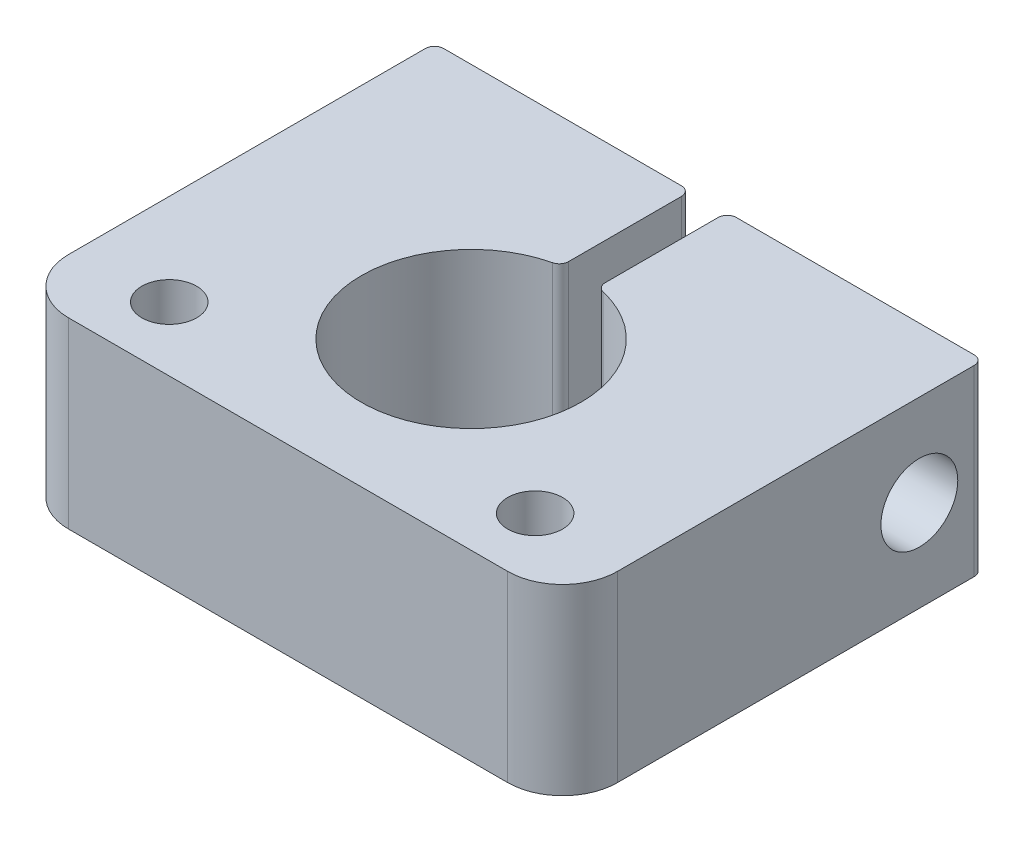
ISO-10303-21;
HEADER;
FILE_DESCRIPTION(('STEP AP214'),'2;1');
FILE_NAME('part.step','',(''),(''),'','','');
FILE_SCHEMA(('AUTOMOTIVE_DESIGN { 1 0 10303 214 1 1 1 1 }'));
ENDSEC;
DATA;
#1=APPLICATION_CONTEXT('core data for automotive mechanical design processes');
#2=APPLICATION_PROTOCOL_DEFINITION('international standard','automotive_design',2000,#1);
#3=PRODUCT_CONTEXT('',#1,'mechanical');
#4=PRODUCT('Part','Part','',(#3));
#5=PRODUCT_RELATED_PRODUCT_CATEGORY('part','',(#4));
#6=PRODUCT_DEFINITION_FORMATION('','',#4);
#7=PRODUCT_DEFINITION_CONTEXT('part definition',#1,'design');
#8=PRODUCT_DEFINITION('design','',#6,#7);
#9=PRODUCT_DEFINITION_SHAPE('','',#8);
#10=(LENGTH_UNIT() NAMED_UNIT(*) SI_UNIT(.MILLI.,.METRE.));
#11=(NAMED_UNIT(*) PLANE_ANGLE_UNIT() SI_UNIT($,.RADIAN.));
#12=(NAMED_UNIT(*) SI_UNIT($,.STERADIAN.) SOLID_ANGLE_UNIT());
#13=UNCERTAINTY_MEASURE_WITH_UNIT(LENGTH_MEASURE(1.E-05),#10,'distance_accuracy_value','');
#14=(GEOMETRIC_REPRESENTATION_CONTEXT(3) GLOBAL_UNCERTAINTY_ASSIGNED_CONTEXT((#13)) GLOBAL_UNIT_ASSIGNED_CONTEXT((#10,
#11,#12)) REPRESENTATION_CONTEXT('',''));
#15=CARTESIAN_POINT('',(0.,0.,0.));
#16=DIRECTION('',(0.,0.,1.));
#17=DIRECTION('',(1.,0.,0.));
#18=AXIS2_PLACEMENT_3D('',#15,#16,#17);
#19=CARTESIAN_POINT('',(0.,10.,0.));
#20=DIRECTION('',(0.,0.,1.));
#21=DIRECTION('',(1.,0.,0.));
#22=AXIS2_PLACEMENT_3D('',#19,#20,#21);
#23=PLANE('',#22);
#24=DIRECTION('',(-1.,0.,0.));
#25=VECTOR('',#24,1.);
#26=CARTESIAN_POINT('',(0.,0.,0.));
#27=LINE('',#26,#25);
#28=CARTESIAN_POINT('',(29.5,0.,0.));
#29=VERTEX_POINT('',#28);
#30=CARTESIAN_POINT('',(16.5,0.,0.));
#31=VERTEX_POINT('',#30);
#32=EDGE_CURVE('E182',#29,#31,#27,.T.);
#33=ORIENTED_EDGE('',*,*,#32,.T.);
#34=DIRECTION('',(0.,1.,0.));
#35=VECTOR('',#34,1.);
#36=CARTESIAN_POINT('',(16.5,10.,0.));
#37=LINE('',#36,#35);
#38=CARTESIAN_POINT('',(16.5,10.,0.));
#39=VERTEX_POINT('',#38);
#40=EDGE_CURVE('E40',#31,#39,#37,.T.);
#41=ORIENTED_EDGE('',*,*,#40,.T.);
#42=DIRECTION('',(-1.,0.,0.));
#43=VECTOR('',#42,1.);
#44=CARTESIAN_POINT('',(0.,10.,0.));
#45=LINE('',#44,#43);
#46=CARTESIAN_POINT('',(29.5,10.,0.));
#47=VERTEX_POINT('',#46);
#48=EDGE_CURVE('E186',#47,#39,#45,.T.);
#49=ORIENTED_EDGE('',*,*,#48,.F.);
#50=DIRECTION('',(0.,-1.,0.));
#51=VECTOR('',#50,1.);
#52=CARTESIAN_POINT('',(29.5,10.,0.));
#53=LINE('',#52,#51);
#54=EDGE_CURVE('E241',#47,#29,#53,.T.);
#55=ORIENTED_EDGE('',*,*,#54,.T.);
#56=EDGE_LOOP('',(#33,#41,#49,#55));
#57=FACE_BOUND('',#56,.T.);
#58=ADVANCED_FACE('F32',(#57),#23,.F.);
#59=CARTESIAN_POINT('',(0.,10.,0.));
#60=DIRECTION('',(0.,1.,0.));
#61=DIRECTION('',(0.,0.,1.));
#62=AXIS2_PLACEMENT_3D('',#59,#60,#61);
#63=PLANE('',#62);
#64=CARTESIAN_POINT('',(13.5,10.,0.));
#65=VERTEX_POINT('',#64);
#66=CARTESIAN_POINT('',(0.5,10.,0.));
#67=VERTEX_POINT('',#66);
#68=EDGE_CURVE('E259',#65,#67,#45,.T.);
#69=ORIENTED_EDGE('',*,*,#68,.T.);
#70=CARTESIAN_POINT('',(0.5,10.,0.5));
#71=DIRECTION('',(0.,1.,0.));
#72=DIRECTION('',(0.,0.,1.));
#73=AXIS2_PLACEMENT_3D('',#70,#71,#72);
#74=CIRCLE('',#73,0.5);
#75=CARTESIAN_POINT('',(0.,10.,0.5));
#76=VERTEX_POINT('',#75);
#77=EDGE_CURVE('E226',#67,#76,#74,.T.);
#78=ORIENTED_EDGE('',*,*,#77,.T.);
#79=DIRECTION('',(0.,0.,1.));
#80=VECTOR('',#79,1.);
#81=CARTESIAN_POINT('',(0.,10.,0.));
#82=LINE('',#81,#80);
#83=CARTESIAN_POINT('',(0.,10.,20.));
#84=VERTEX_POINT('',#83);
#85=EDGE_CURVE('E185',#76,#84,#82,.T.);
#86=ORIENTED_EDGE('',*,*,#85,.T.);
#87=CARTESIAN_POINT('',(3.,10.,20.));
#88=DIRECTION('',(0.,1.,0.));
#89=DIRECTION('',(0.,0.,1.));
#90=AXIS2_PLACEMENT_3D('',#87,#88,#89);
#91=CIRCLE('',#90,3.);
#92=CARTESIAN_POINT('',(3.,10.,23.));
#93=VERTEX_POINT('',#92);
#94=EDGE_CURVE('E192',#84,#93,#91,.T.);
#95=ORIENTED_EDGE('',*,*,#94,.T.);
#96=DIRECTION('',(1.,0.,0.));
#97=VECTOR('',#96,1.);
#98=CARTESIAN_POINT('',(0.,10.,23.));
#99=LINE('',#98,#97);
#100=CARTESIAN_POINT('',(27.,10.,23.));
#101=VERTEX_POINT('',#100);
#102=EDGE_CURVE('E166',#93,#101,#99,.T.);
#103=ORIENTED_EDGE('',*,*,#102,.T.);
#104=CARTESIAN_POINT('',(27.,10.,20.));
#105=DIRECTION('',(0.,1.,0.));
#106=DIRECTION('',(0.,0.,1.));
#107=AXIS2_PLACEMENT_3D('',#104,#105,#106);
#108=CIRCLE('',#107,3.);
#109=CARTESIAN_POINT('',(30.,10.,20.));
#110=VERTEX_POINT('',#109);
#111=EDGE_CURVE('E190',#101,#110,#108,.T.);
#112=ORIENTED_EDGE('',*,*,#111,.T.);
#113=DIRECTION('',(0.,0.,-1.));
#114=VECTOR('',#113,1.);
#115=CARTESIAN_POINT('',(30.,10.,0.));
#116=LINE('',#115,#114);
#117=CARTESIAN_POINT('',(30.,10.,0.5));
#118=VERTEX_POINT('',#117);
#119=EDGE_CURVE('E260',#110,#118,#116,.T.);
#120=ORIENTED_EDGE('',*,*,#119,.T.);
#121=CARTESIAN_POINT('',(29.5,10.,0.5));
#122=DIRECTION('',(0.,1.,0.));
#123=DIRECTION('',(0.,0.,1.));
#124=AXIS2_PLACEMENT_3D('',#121,#122,#123);
#125=CIRCLE('',#124,0.5);
#126=EDGE_CURVE('E217',#118,#47,#125,.T.);
#127=ORIENTED_EDGE('',*,*,#126,.T.);
#128=ORIENTED_EDGE('',*,*,#48,.T.);
#129=CARTESIAN_POINT('',(16.5,10.,0.5));
#130=DIRECTION('',(0.,1.,0.));
#131=DIRECTION('',(0.,0.,1.));
#132=AXIS2_PLACEMENT_3D('',#129,#130,#131);
#133=CIRCLE('',#132,0.5);
#134=CARTESIAN_POINT('',(16.,10.,0.5));
#135=VERTEX_POINT('',#134);
#136=EDGE_CURVE('E219',#39,#135,#133,.T.);
#137=ORIENTED_EDGE('',*,*,#136,.T.);
#138=DIRECTION('',(0.,0.,-1.));
#139=VECTOR('',#138,1.);
#140=CARTESIAN_POINT('',(16.,10.,-3.));
#141=LINE('',#140,#139);
#142=CARTESIAN_POINT('',(16.,10.,6.67544467966324));
#143=VERTEX_POINT('',#142);
#144=EDGE_CURVE('E286',#143,#135,#141,.T.);
#145=ORIENTED_EDGE('',*,*,#144,.F.);
#146=CARTESIAN_POINT('',(16.5,10.,6.67544467966324));
#147=DIRECTION('',(0.,1.,0.));
#148=DIRECTION('',(0.,0.,1.));
#149=AXIS2_PLACEMENT_3D('',#146,#147,#148);
#150=CIRCLE('',#149,0.5);
#151=CARTESIAN_POINT('',(16.3846153846154,10.,7.16194893507376));
#152=VERTEX_POINT('',#151);
#153=EDGE_CURVE('E224',#143,#152,#150,.T.);
#154=ORIENTED_EDGE('',*,*,#153,.T.);
#155=CARTESIAN_POINT('',(15.,10.,13.));
#156=DIRECTION('',(0.,1.,0.));
#157=DIRECTION('',(0.,0.,1.));
#158=AXIS2_PLACEMENT_3D('',#155,#156,#157);
#159=CIRCLE('',#158,6.);
#160=CARTESIAN_POINT('',(13.6153846153846,10.,7.16194893507376));
#161=VERTEX_POINT('',#160);
#162=EDGE_CURVE('E178',#161,#152,#159,.T.);
#163=ORIENTED_EDGE('',*,*,#162,.F.);
#164=CARTESIAN_POINT('',(13.5,10.,6.67544467966324));
#165=DIRECTION('',(0.,1.,0.));
#166=DIRECTION('',(0.,0.,1.));
#167=AXIS2_PLACEMENT_3D('',#164,#165,#166);
#168=CIRCLE('',#167,0.5);
#169=CARTESIAN_POINT('',(14.,10.,6.67544467966323));
#170=VERTEX_POINT('',#169);
#171=EDGE_CURVE('E47',#161,#170,#168,.T.);
#172=ORIENTED_EDGE('',*,*,#171,.T.);
#173=DIRECTION('',(0.,0.,1.));
#174=VECTOR('',#173,1.);
#175=CARTESIAN_POINT('',(14.,10.,-3.));
#176=LINE('',#175,#174);
#177=CARTESIAN_POINT('',(14.,10.,0.499999999999999));
#178=VERTEX_POINT('',#177);
#179=EDGE_CURVE('E283',#178,#170,#176,.T.);
#180=ORIENTED_EDGE('',*,*,#179,.F.);
#181=CARTESIAN_POINT('',(13.5,10.,0.5));
#182=DIRECTION('',(0.,1.,0.));
#183=DIRECTION('',(0.,0.,1.));
#184=AXIS2_PLACEMENT_3D('',#181,#182,#183);
#185=CIRCLE('',#184,0.5);
#186=EDGE_CURVE('E221',#178,#65,#185,.T.);
#187=ORIENTED_EDGE('',*,*,#186,.T.);
#188=EDGE_LOOP('',(#69,#78,#86,#95,#103,#112,#120,#127,#128,#137,#145,#154,#163,#172,#180,#187));
#189=FACE_BOUND('',#188,.T.);
#190=CARTESIAN_POINT('',(5.,10.,19.5));
#191=DIRECTION('',(0.,1.,0.));
#192=DIRECTION('',(0.,0.,1.));
#193=AXIS2_PLACEMENT_3D('',#190,#191,#192);
#194=CIRCLE('',#193,1.5);
#195=CARTESIAN_POINT('',(5.,10.,21.));
#196=VERTEX_POINT('',#195);
#197=EDGE_CURVE('E268',#196,#196,#194,.T.);
#198=ORIENTED_EDGE('',*,*,#197,.F.);
#199=EDGE_LOOP('',(#198));
#200=FACE_BOUND('',#199,.T.);
#201=CARTESIAN_POINT('',(25.,10.,19.5));
#202=DIRECTION('',(0.,1.,0.));
#203=DIRECTION('',(0.,0.,1.));
#204=AXIS2_PLACEMENT_3D('',#201,#202,#203);
#205=CIRCLE('',#204,1.5);
#206=CARTESIAN_POINT('',(25.,10.,21.));
#207=VERTEX_POINT('',#206);
#208=EDGE_CURVE('E274',#207,#207,#205,.T.);
#209=ORIENTED_EDGE('',*,*,#208,.F.);
#210=EDGE_LOOP('',(#209));
#211=FACE_BOUND('',#210,.T.);
#212=ADVANCED_FACE('F253',(#189,#200,#211),#63,.T.);
#213=CARTESIAN_POINT('',(0.,0.,0.));
#214=DIRECTION('',(0.,1.,0.));
#215=DIRECTION('',(0.,0.,1.));
#216=AXIS2_PLACEMENT_3D('',#213,#214,#215);
#217=PLANE('',#216);
#218=DIRECTION('',(0.,0.,1.));
#219=VECTOR('',#218,1.);
#220=CARTESIAN_POINT('',(0.,0.,0.));
#221=LINE('',#220,#219);
#222=CARTESIAN_POINT('',(0.,0.,0.5));
#223=VERTEX_POINT('',#222);
#224=CARTESIAN_POINT('',(0.,0.,20.));
#225=VERTEX_POINT('',#224);
#226=EDGE_CURVE('E173',#223,#225,#221,.T.);
#227=ORIENTED_EDGE('',*,*,#226,.F.);
#228=CARTESIAN_POINT('',(0.5,0.,0.5));
#229=DIRECTION('',(0.,1.,0.));
#230=DIRECTION('',(0.,0.,1.));
#231=AXIS2_PLACEMENT_3D('',#228,#229,#230);
#232=CIRCLE('',#231,0.5);
#233=CARTESIAN_POINT('',(0.5,0.,0.));
#234=VERTEX_POINT('',#233);
#235=EDGE_CURVE('E210',#223,#234,#232,.F.);
#236=ORIENTED_EDGE('',*,*,#235,.T.);
#237=CARTESIAN_POINT('',(13.5,0.,0.));
#238=VERTEX_POINT('',#237);
#239=EDGE_CURVE('E176',#238,#234,#27,.T.);
#240=ORIENTED_EDGE('',*,*,#239,.F.);
#241=CARTESIAN_POINT('',(13.5,0.,0.5));
#242=DIRECTION('',(0.,1.,0.));
#243=DIRECTION('',(0.,0.,1.));
#244=AXIS2_PLACEMENT_3D('',#241,#242,#243);
#245=CIRCLE('',#244,0.5);
#246=CARTESIAN_POINT('',(14.,0.,0.499999999999999));
#247=VERTEX_POINT('',#246);
#248=EDGE_CURVE('E204',#238,#247,#245,.F.);
#249=ORIENTED_EDGE('',*,*,#248,.T.);
#250=DIRECTION('',(0.,0.,1.));
#251=VECTOR('',#250,1.);
#252=CARTESIAN_POINT('',(14.,0.,-3.));
#253=LINE('',#252,#251);
#254=CARTESIAN_POINT('',(14.,0.,6.67544467966323));
#255=VERTEX_POINT('',#254);
#256=EDGE_CURVE('E280',#247,#255,#253,.T.);
#257=ORIENTED_EDGE('',*,*,#256,.T.);
#258=CARTESIAN_POINT('',(13.5,0.,6.67544467966324));
#259=DIRECTION('',(0.,1.,0.));
#260=DIRECTION('',(0.,0.,1.));
#261=AXIS2_PLACEMENT_3D('',#258,#259,#260);
#262=CIRCLE('',#261,0.5);
#263=CARTESIAN_POINT('',(13.6153846153846,0.,7.16194893507376));
#264=VERTEX_POINT('',#263);
#265=EDGE_CURVE('E206',#255,#264,#262,.F.);
#266=ORIENTED_EDGE('',*,*,#265,.T.);
#267=CARTESIAN_POINT('',(15.,0.,13.));
#268=DIRECTION('',(0.,1.,0.));
#269=DIRECTION('',(0.,0.,1.));
#270=AXIS2_PLACEMENT_3D('',#267,#268,#269);
#271=CIRCLE('',#270,6.);
#272=CARTESIAN_POINT('',(16.3846153846154,0.,7.16194893507376));
#273=VERTEX_POINT('',#272);
#274=EDGE_CURVE('E265',#264,#273,#271,.T.);
#275=ORIENTED_EDGE('',*,*,#274,.T.);
#276=CARTESIAN_POINT('',(16.5,0.,6.67544467966324));
#277=DIRECTION('',(0.,1.,0.));
#278=DIRECTION('',(0.,0.,1.));
#279=AXIS2_PLACEMENT_3D('',#276,#277,#278);
#280=CIRCLE('',#279,0.5);
#281=CARTESIAN_POINT('',(16.,0.,6.67544467966324));
#282=VERTEX_POINT('',#281);
#283=EDGE_CURVE('E208',#273,#282,#280,.F.);
#284=ORIENTED_EDGE('',*,*,#283,.T.);
#285=DIRECTION('',(0.,0.,-1.));
#286=VECTOR('',#285,1.);
#287=CARTESIAN_POINT('',(16.,0.,-3.));
#288=LINE('',#287,#286);
#289=CARTESIAN_POINT('',(16.,0.,0.5));
#290=VERTEX_POINT('',#289);
#291=EDGE_CURVE('E285',#282,#290,#288,.T.);
#292=ORIENTED_EDGE('',*,*,#291,.T.);
#293=CARTESIAN_POINT('',(16.5,0.,0.5));
#294=DIRECTION('',(0.,1.,0.));
#295=DIRECTION('',(0.,0.,1.));
#296=AXIS2_PLACEMENT_3D('',#293,#294,#295);
#297=CIRCLE('',#296,0.5);
#298=EDGE_CURVE('E202',#290,#31,#297,.F.);
#299=ORIENTED_EDGE('',*,*,#298,.T.);
#300=ORIENTED_EDGE('',*,*,#32,.F.);
#301=CARTESIAN_POINT('',(29.5,0.,0.5));
#302=DIRECTION('',(0.,1.,0.));
#303=DIRECTION('',(0.,0.,1.));
#304=AXIS2_PLACEMENT_3D('',#301,#302,#303);
#305=CIRCLE('',#304,0.5);
#306=CARTESIAN_POINT('',(30.,0.,0.5));
#307=VERTEX_POINT('',#306);
#308=EDGE_CURVE('E200',#29,#307,#305,.F.);
#309=ORIENTED_EDGE('',*,*,#308,.T.);
#310=DIRECTION('',(0.,0.,-1.));
#311=VECTOR('',#310,1.);
#312=CARTESIAN_POINT('',(30.,0.,0.));
#313=LINE('',#312,#311);
#314=CARTESIAN_POINT('',(30.,0.,20.));
#315=VERTEX_POINT('',#314);
#316=EDGE_CURVE('E172',#315,#307,#313,.T.);
#317=ORIENTED_EDGE('',*,*,#316,.F.);
#318=CARTESIAN_POINT('',(27.,0.,20.));
#319=DIRECTION('',(0.,1.,0.));
#320=DIRECTION('',(0.,0.,1.));
#321=AXIS2_PLACEMENT_3D('',#318,#319,#320);
#322=CIRCLE('',#321,3.);
#323=CARTESIAN_POINT('',(27.,0.,23.));
#324=VERTEX_POINT('',#323);
#325=EDGE_CURVE('E157',#315,#324,#322,.F.);
#326=ORIENTED_EDGE('',*,*,#325,.T.);
#327=DIRECTION('',(1.,0.,0.));
#328=VECTOR('',#327,1.);
#329=CARTESIAN_POINT('',(0.,0.,23.));
#330=LINE('',#329,#328);
#331=CARTESIAN_POINT('',(3.,0.,23.));
#332=VERTEX_POINT('',#331);
#333=EDGE_CURVE('E163',#332,#324,#330,.T.);
#334=ORIENTED_EDGE('',*,*,#333,.F.);
#335=CARTESIAN_POINT('',(3.,0.,20.));
#336=DIRECTION('',(0.,1.,0.));
#337=DIRECTION('',(0.,0.,1.));
#338=AXIS2_PLACEMENT_3D('',#335,#336,#337);
#339=CIRCLE('',#338,3.);
#340=EDGE_CURVE('E147',#332,#225,#339,.F.);
#341=ORIENTED_EDGE('',*,*,#340,.T.);
#342=EDGE_LOOP('',(#227,#236,#240,#249,#257,#266,#275,#284,#292,#299,#300,#309,#317,#326,#334,#341));
#343=FACE_BOUND('',#342,.T.);
#344=CARTESIAN_POINT('',(5.,0.,19.5));
#345=DIRECTION('',(0.,1.,0.));
#346=DIRECTION('',(0.,0.,1.));
#347=AXIS2_PLACEMENT_3D('',#344,#345,#346);
#348=CIRCLE('',#347,1.5);
#349=CARTESIAN_POINT('',(5.,0.,21.));
#350=VERTEX_POINT('',#349);
#351=EDGE_CURVE('E271',#350,#350,#348,.T.);
#352=ORIENTED_EDGE('',*,*,#351,.T.);
#353=EDGE_LOOP('',(#352));
#354=FACE_BOUND('',#353,.T.);
#355=CARTESIAN_POINT('',(25.,0.,19.5));
#356=DIRECTION('',(0.,1.,0.));
#357=DIRECTION('',(0.,0.,1.));
#358=AXIS2_PLACEMENT_3D('',#355,#356,#357);
#359=CIRCLE('',#358,1.5);
#360=CARTESIAN_POINT('',(25.,0.,21.));
#361=VERTEX_POINT('',#360);
#362=EDGE_CURVE('E277',#361,#361,#359,.T.);
#363=ORIENTED_EDGE('',*,*,#362,.T.);
#364=EDGE_LOOP('',(#363));
#365=FACE_BOUND('',#364,.T.);
#366=ADVANCED_FACE('F169',(#343,#354,#365),#217,.F.);
#367=CARTESIAN_POINT('',(0.,10.,0.));
#368=DIRECTION('',(1.,0.,0.));
#369=DIRECTION('',(0.,0.,-1.));
#370=AXIS2_PLACEMENT_3D('',#367,#368,#369);
#371=PLANE('',#370);
#372=CARTESIAN_POINT('',(0.,5.,3.5));
#373=DIRECTION('',(1.,0.,0.));
#374=DIRECTION('',(0.,0.,-1.));
#375=AXIS2_PLACEMENT_3D('',#372,#373,#374);
#376=CIRCLE('',#375,1.25);
#377=CARTESIAN_POINT('',(0.,5.,2.25));
#378=VERTEX_POINT('',#377);
#379=EDGE_CURVE('E298',#378,#378,#376,.T.);
#380=ORIENTED_EDGE('',*,*,#379,.T.);
#381=EDGE_LOOP('',(#380));
#382=FACE_BOUND('',#381,.T.);
#383=ORIENTED_EDGE('',*,*,#85,.F.);
#384=DIRECTION('',(0.,-1.,0.));
#385=VECTOR('',#384,1.);
#386=CARTESIAN_POINT('',(0.,10.,0.5));
#387=LINE('',#386,#385);
#388=EDGE_CURVE('E197',#76,#223,#387,.T.);
#389=ORIENTED_EDGE('',*,*,#388,.T.);
#390=ORIENTED_EDGE('',*,*,#226,.T.);
#391=DIRECTION('',(0.,-1.,0.));
#392=VECTOR('',#391,1.);
#393=CARTESIAN_POINT('',(0.,10.,20.));
#394=LINE('',#393,#392);
#395=EDGE_CURVE('E153',#225,#84,#394,.F.);
#396=ORIENTED_EDGE('',*,*,#395,.T.);
#397=EDGE_LOOP('',(#383,#389,#390,#396));
#398=FACE_BOUND('',#397,.T.);
#399=ADVANCED_FACE('F370',(#382,#398),#371,.F.);
#400=CARTESIAN_POINT('',(0.,10.,23.));
#401=DIRECTION('',(0.,0.,-1.));
#402=DIRECTION('',(-1.,0.,0.));
#403=AXIS2_PLACEMENT_3D('',#400,#401,#402);
#404=PLANE('',#403);
#405=ORIENTED_EDGE('',*,*,#102,.F.);
#406=DIRECTION('',(0.,-1.,0.));
#407=VECTOR('',#406,1.);
#408=CARTESIAN_POINT('',(3.,10.,23.));
#409=LINE('',#408,#407);
#410=EDGE_CURVE('E151',#93,#332,#409,.T.);
#411=ORIENTED_EDGE('',*,*,#410,.T.);
#412=ORIENTED_EDGE('',*,*,#333,.T.);
#413=DIRECTION('',(0.,-1.,0.));
#414=VECTOR('',#413,1.);
#415=CARTESIAN_POINT('',(27.,10.,23.));
#416=LINE('',#415,#414);
#417=EDGE_CURVE('E167',#324,#101,#416,.F.);
#418=ORIENTED_EDGE('',*,*,#417,.T.);
#419=EDGE_LOOP('',(#405,#411,#412,#418));
#420=FACE_BOUND('',#419,.T.);
#421=ADVANCED_FACE('F162',(#420),#404,.F.);
#422=CARTESIAN_POINT('',(30.,10.,0.));
#423=DIRECTION('',(-1.,0.,0.));
#424=DIRECTION('',(0.,0.,1.));
#425=AXIS2_PLACEMENT_3D('',#422,#423,#424);
#426=PLANE('',#425);
#427=CARTESIAN_POINT('',(30.,5.,3.5));
#428=DIRECTION('',(1.,0.,0.));
#429=DIRECTION('',(0.,0.,-1.));
#430=AXIS2_PLACEMENT_3D('',#427,#428,#429);
#431=CIRCLE('',#430,2.1);
#432=CARTESIAN_POINT('',(30.,5.,1.4));
#433=VERTEX_POINT('',#432);
#434=EDGE_CURVE('E288',#433,#433,#431,.T.);
#435=ORIENTED_EDGE('',*,*,#434,.F.);
#436=EDGE_LOOP('',(#435));
#437=FACE_BOUND('',#436,.T.);
#438=ORIENTED_EDGE('',*,*,#316,.T.);
#439=DIRECTION('',(0.,-1.,0.));
#440=VECTOR('',#439,1.);
#441=CARTESIAN_POINT('',(30.,10.,0.5));
#442=LINE('',#441,#440);
#443=EDGE_CURVE('E11',#307,#118,#442,.F.);
#444=ORIENTED_EDGE('',*,*,#443,.T.);
#445=ORIENTED_EDGE('',*,*,#119,.F.);
#446=DIRECTION('',(0.,-1.,0.));
#447=VECTOR('',#446,1.);
#448=CARTESIAN_POINT('',(30.,10.,20.));
#449=LINE('',#448,#447);
#450=EDGE_CURVE('E194',#110,#315,#449,.T.);
#451=ORIENTED_EDGE('',*,*,#450,.T.);
#452=EDGE_LOOP('',(#438,#444,#445,#451));
#453=FACE_BOUND('',#452,.T.);
#454=ADVANCED_FACE('F333',(#437,#453),#426,.F.);
#455=ORIENTED_EDGE('',*,*,#239,.T.);
#456=DIRECTION('',(0.,-1.,0.));
#457=VECTOR('',#456,1.);
#458=CARTESIAN_POINT('',(0.5,10.,0.));
#459=LINE('',#458,#457);
#460=EDGE_CURVE('E215',#234,#67,#459,.F.);
#461=ORIENTED_EDGE('',*,*,#460,.T.);
#462=ORIENTED_EDGE('',*,*,#68,.F.);
#463=DIRECTION('',(0.,-1.,0.));
#464=VECTOR('',#463,1.);
#465=CARTESIAN_POINT('',(13.5,10.,0.));
#466=LINE('',#465,#464);
#467=EDGE_CURVE('E212',#65,#238,#466,.T.);
#468=ORIENTED_EDGE('',*,*,#467,.T.);
#469=EDGE_LOOP('',(#455,#461,#462,#468));
#470=FACE_BOUND('',#469,.T.);
#471=ADVANCED_FACE('F343',(#470),#23,.F.);
#472=CARTESIAN_POINT('',(15.,10.,13.));
#473=DIRECTION('',(0.,-1.,0.));
#474=DIRECTION('',(0.,0.,-1.));
#475=AXIS2_PLACEMENT_3D('',#472,#473,#474);
#476=CYLINDRICAL_SURFACE('',#475,6.);
#477=ORIENTED_EDGE('',*,*,#162,.T.);
#478=DIRECTION('',(0.,-1.,0.));
#479=VECTOR('',#478,1.);
#480=CARTESIAN_POINT('',(16.3846153846154,10.,7.16194893507376));
#481=LINE('',#480,#479);
#482=EDGE_CURVE('E235',#152,#273,#481,.T.);
#483=ORIENTED_EDGE('',*,*,#482,.T.);
#484=ORIENTED_EDGE('',*,*,#274,.F.);
#485=DIRECTION('',(0.,-1.,0.));
#486=VECTOR('',#485,1.);
#487=CARTESIAN_POINT('',(13.6153846153846,10.,7.16194893507376));
#488=LINE('',#487,#486);
#489=EDGE_CURVE('E233',#264,#161,#488,.F.);
#490=ORIENTED_EDGE('',*,*,#489,.T.);
#491=EDGE_LOOP('',(#477,#483,#484,#490));
#492=FACE_BOUND('',#491,.T.);
#493=ADVANCED_FACE('F321',(#492),#476,.F.);
#494=CARTESIAN_POINT('',(5.,10.,19.5));
#495=DIRECTION('',(0.,-1.,0.));
#496=DIRECTION('',(0.,0.,-1.));
#497=AXIS2_PLACEMENT_3D('',#494,#495,#496);
#498=CYLINDRICAL_SURFACE('',#497,1.5);
#499=ORIENTED_EDGE('',*,*,#197,.T.);
#500=EDGE_LOOP('',(#499));
#501=FACE_BOUND('',#500,.T.);
#502=ORIENTED_EDGE('',*,*,#351,.F.);
#503=EDGE_LOOP('',(#502));
#504=FACE_BOUND('',#503,.T.);
#505=ADVANCED_FACE('F356',(#501,#504),#498,.F.);
#506=CARTESIAN_POINT('',(25.,10.,19.5));
#507=DIRECTION('',(0.,-1.,0.));
#508=DIRECTION('',(0.,0.,-1.));
#509=AXIS2_PLACEMENT_3D('',#506,#507,#508);
#510=CYLINDRICAL_SURFACE('',#509,1.5);
#511=ORIENTED_EDGE('',*,*,#208,.T.);
#512=EDGE_LOOP('',(#511));
#513=FACE_BOUND('',#512,.T.);
#514=ORIENTED_EDGE('',*,*,#362,.F.);
#515=EDGE_LOOP('',(#514));
#516=FACE_BOUND('',#515,.T.);
#517=ADVANCED_FACE('F311',(#513,#516),#510,.F.);
#518=CARTESIAN_POINT('',(14.,0.,-3.));
#519=DIRECTION('',(-1.,0.,0.));
#520=DIRECTION('',(0.,0.,1.));
#521=AXIS2_PLACEMENT_3D('',#518,#519,#520);
#522=PLANE('',#521);
#523=CARTESIAN_POINT('',(14.,5.,3.5));
#524=DIRECTION('',(1.,0.,0.));
#525=DIRECTION('',(0.,0.,-1.));
#526=AXIS2_PLACEMENT_3D('',#523,#524,#525);
#527=CIRCLE('',#526,1.25);
#528=CARTESIAN_POINT('',(14.,5.,2.25));
#529=VERTEX_POINT('',#528);
#530=EDGE_CURVE('E301',#529,#529,#527,.T.);
#531=ORIENTED_EDGE('',*,*,#530,.F.);
#532=EDGE_LOOP('',(#531));
#533=FACE_BOUND('',#532,.T.);
#534=ORIENTED_EDGE('',*,*,#179,.T.);
#535=DIRECTION('',(0.,1.,0.));
#536=VECTOR('',#535,1.);
#537=CARTESIAN_POINT('',(14.,0.,6.67544467966324));
#538=LINE('',#537,#536);
#539=EDGE_CURVE('E238',#170,#255,#538,.F.);
#540=ORIENTED_EDGE('',*,*,#539,.T.);
#541=ORIENTED_EDGE('',*,*,#256,.F.);
#542=DIRECTION('',(0.,-1.,0.));
#543=VECTOR('',#542,1.);
#544=CARTESIAN_POINT('',(14.,0.,0.5));
#545=LINE('',#544,#543);
#546=EDGE_CURVE('E54',#247,#178,#545,.F.);
#547=ORIENTED_EDGE('',*,*,#546,.T.);
#548=EDGE_LOOP('',(#534,#540,#541,#547));
#549=FACE_BOUND('',#548,.T.);
#550=ADVANCED_FACE('F308',(#533,#549),#522,.F.);
#551=CARTESIAN_POINT('',(16.,0.,-3.));
#552=DIRECTION('',(1.,0.,0.));
#553=DIRECTION('',(0.,0.,-1.));
#554=AXIS2_PLACEMENT_3D('',#551,#552,#553);
#555=PLANE('',#554);
#556=CARTESIAN_POINT('',(16.,5.,3.5));
#557=DIRECTION('',(1.,0.,0.));
#558=DIRECTION('',(0.,0.,-1.));
#559=AXIS2_PLACEMENT_3D('',#556,#557,#558);
#560=CIRCLE('',#559,2.1);
#561=CARTESIAN_POINT('',(16.,5.,1.4));
#562=VERTEX_POINT('',#561);
#563=EDGE_CURVE('E295',#562,#562,#560,.F.);
#564=ORIENTED_EDGE('',*,*,#563,.F.);
#565=EDGE_LOOP('',(#564));
#566=FACE_BOUND('',#565,.T.);
#567=ORIENTED_EDGE('',*,*,#291,.F.);
#568=DIRECTION('',(0.,1.,0.));
#569=VECTOR('',#568,1.);
#570=CARTESIAN_POINT('',(16.,10.,6.67544467966324));
#571=LINE('',#570,#569);
#572=EDGE_CURVE('E230',#282,#143,#571,.T.);
#573=ORIENTED_EDGE('',*,*,#572,.T.);
#574=ORIENTED_EDGE('',*,*,#144,.T.);
#575=DIRECTION('',(0.,1.,0.));
#576=VECTOR('',#575,1.);
#577=CARTESIAN_POINT('',(16.,0.,0.5));
#578=LINE('',#577,#576);
#579=EDGE_CURVE('E228',#135,#290,#578,.F.);
#580=ORIENTED_EDGE('',*,*,#579,.T.);
#581=EDGE_LOOP('',(#567,#573,#574,#580));
#582=FACE_BOUND('',#581,.T.);
#583=ADVANCED_FACE('F310',(#566,#582),#555,.F.);
#584=CARTESIAN_POINT('',(-0.00100000000000794,5.,3.50000000000001));
#585=DIRECTION('',(1.,0.,0.));
#586=DIRECTION('',(0.,0.,-1.));
#587=AXIS2_PLACEMENT_3D('',#584,#585,#586);
#588=CYLINDRICAL_SURFACE('',#587,2.1);
#589=ORIENTED_EDGE('',*,*,#434,.T.);
#590=EDGE_LOOP('',(#589));
#591=FACE_BOUND('',#590,.T.);
#592=ORIENTED_EDGE('',*,*,#563,.T.);
#593=EDGE_LOOP('',(#592));
#594=FACE_BOUND('',#593,.T.);
#595=ADVANCED_FACE('F439',(#591,#594),#588,.F.);
#596=CARTESIAN_POINT('',(-6.00000000000001,5.,3.50000000000001));
#597=DIRECTION('',(1.,0.,0.));
#598=DIRECTION('',(0.,0.,-1.));
#599=AXIS2_PLACEMENT_3D('',#596,#597,#598);
#600=CYLINDRICAL_SURFACE('',#599,1.25);
#601=ORIENTED_EDGE('',*,*,#530,.T.);
#602=EDGE_LOOP('',(#601));
#603=FACE_BOUND('',#602,.T.);
#604=ORIENTED_EDGE('',*,*,#379,.F.);
#605=EDGE_LOOP('',(#604));
#606=FACE_BOUND('',#605,.T.);
#607=ADVANCED_FACE('F305',(#603,#606),#600,.F.);
#608=CARTESIAN_POINT('',(3.,10.,20.));
#609=DIRECTION('',(0.,-1.,0.));
#610=DIRECTION('',(0.,0.,-1.));
#611=AXIS2_PLACEMENT_3D('',#608,#609,#610);
#612=CYLINDRICAL_SURFACE('',#611,3.);
#613=ORIENTED_EDGE('',*,*,#94,.F.);
#614=ORIENTED_EDGE('',*,*,#395,.F.);
#615=ORIENTED_EDGE('',*,*,#340,.F.);
#616=ORIENTED_EDGE('',*,*,#410,.F.);
#617=EDGE_LOOP('',(#613,#614,#615,#616));
#618=FACE_BOUND('',#617,.T.);
#619=ADVANCED_FACE('F150',(#618),#612,.T.);
#620=CARTESIAN_POINT('',(27.,10.,20.));
#621=DIRECTION('',(0.,-1.,0.));
#622=DIRECTION('',(0.,0.,-1.));
#623=AXIS2_PLACEMENT_3D('',#620,#621,#622);
#624=CYLINDRICAL_SURFACE('',#623,3.);
#625=ORIENTED_EDGE('',*,*,#111,.F.);
#626=ORIENTED_EDGE('',*,*,#417,.F.);
#627=ORIENTED_EDGE('',*,*,#325,.F.);
#628=ORIENTED_EDGE('',*,*,#450,.F.);
#629=EDGE_LOOP('',(#625,#626,#627,#628));
#630=FACE_BOUND('',#629,.T.);
#631=ADVANCED_FACE('F373',(#630),#624,.T.);
#632=CARTESIAN_POINT('',(0.5,10.,0.5));
#633=DIRECTION('',(0.,-1.,0.));
#634=DIRECTION('',(0.,0.,-1.));
#635=AXIS2_PLACEMENT_3D('',#632,#633,#634);
#636=CYLINDRICAL_SURFACE('',#635,0.5);
#637=ORIENTED_EDGE('',*,*,#77,.F.);
#638=ORIENTED_EDGE('',*,*,#460,.F.);
#639=ORIENTED_EDGE('',*,*,#235,.F.);
#640=ORIENTED_EDGE('',*,*,#388,.F.);
#641=EDGE_LOOP('',(#637,#638,#639,#640));
#642=FACE_BOUND('',#641,.T.);
#643=ADVANCED_FACE('F366',(#642),#636,.T.);
#644=CARTESIAN_POINT('',(16.5,10.,6.67544467966324));
#645=DIRECTION('',(0.,-1.,0.));
#646=DIRECTION('',(0.,0.,-1.));
#647=AXIS2_PLACEMENT_3D('',#644,#645,#646);
#648=CYLINDRICAL_SURFACE('',#647,0.5);
#649=ORIENTED_EDGE('',*,*,#283,.F.);
#650=ORIENTED_EDGE('',*,*,#482,.F.);
#651=ORIENTED_EDGE('',*,*,#153,.F.);
#652=ORIENTED_EDGE('',*,*,#572,.F.);
#653=EDGE_LOOP('',(#649,#650,#651,#652));
#654=FACE_BOUND('',#653,.T.);
#655=ADVANCED_FACE('F324',(#654),#648,.T.);
#656=CARTESIAN_POINT('',(13.5,10.,6.67544467966324));
#657=DIRECTION('',(0.,-1.,0.));
#658=DIRECTION('',(0.,0.,-1.));
#659=AXIS2_PLACEMENT_3D('',#656,#657,#658);
#660=CYLINDRICAL_SURFACE('',#659,0.5);
#661=ORIENTED_EDGE('',*,*,#171,.F.);
#662=ORIENTED_EDGE('',*,*,#489,.F.);
#663=ORIENTED_EDGE('',*,*,#265,.F.);
#664=ORIENTED_EDGE('',*,*,#539,.F.);
#665=EDGE_LOOP('',(#661,#662,#663,#664));
#666=FACE_BOUND('',#665,.T.);
#667=ADVANCED_FACE('F316',(#666),#660,.T.);
#668=CARTESIAN_POINT('',(13.5,10.,0.5));
#669=DIRECTION('',(0.,-1.,0.));
#670=DIRECTION('',(0.,0.,-1.));
#671=AXIS2_PLACEMENT_3D('',#668,#669,#670);
#672=CYLINDRICAL_SURFACE('',#671,0.5);
#673=ORIENTED_EDGE('',*,*,#186,.F.);
#674=ORIENTED_EDGE('',*,*,#546,.F.);
#675=ORIENTED_EDGE('',*,*,#248,.F.);
#676=ORIENTED_EDGE('',*,*,#467,.F.);
#677=EDGE_LOOP('',(#673,#674,#675,#676));
#678=FACE_BOUND('',#677,.T.);
#679=ADVANCED_FACE('F340',(#678),#672,.T.);
#680=CARTESIAN_POINT('',(16.5,10.,0.5));
#681=DIRECTION('',(0.,1.,0.));
#682=DIRECTION('',(0.,0.,1.));
#683=AXIS2_PLACEMENT_3D('',#680,#681,#682);
#684=CYLINDRICAL_SURFACE('',#683,0.5);
#685=ORIENTED_EDGE('',*,*,#298,.F.);
#686=ORIENTED_EDGE('',*,*,#579,.F.);
#687=ORIENTED_EDGE('',*,*,#136,.F.);
#688=ORIENTED_EDGE('',*,*,#40,.F.);
#689=EDGE_LOOP('',(#685,#686,#687,#688));
#690=FACE_BOUND('',#689,.T.);
#691=ADVANCED_FACE('F329',(#690),#684,.T.);
#692=CARTESIAN_POINT('',(29.5,10.,0.5));
#693=DIRECTION('',(0.,-1.,0.));
#694=DIRECTION('',(0.,0.,-1.));
#695=AXIS2_PLACEMENT_3D('',#692,#693,#694);
#696=CYLINDRICAL_SURFACE('',#695,0.5);
#697=ORIENTED_EDGE('',*,*,#126,.F.);
#698=ORIENTED_EDGE('',*,*,#443,.F.);
#699=ORIENTED_EDGE('',*,*,#308,.F.);
#700=ORIENTED_EDGE('',*,*,#54,.F.);
#701=EDGE_LOOP('',(#697,#698,#699,#700));
#702=FACE_BOUND('',#701,.T.);
#703=ADVANCED_FACE('F34',(#702),#696,.T.);
#704=CLOSED_SHELL('',(#58,#212,#366,#399,#421,#454,#471,#493,#505,#517,#550,#583,#595,#607,#619,
#631,#643,#655,#667,#679,#691,#703));
#705=MANIFOLD_SOLID_BREP('B2',#704);
#706=ADVANCED_BREP_SHAPE_REPRESENTATION('',(#18,#705),#14);
#707=SHAPE_DEFINITION_REPRESENTATION(#9,#706);
ENDSEC;
END-ISO-10303-21;
